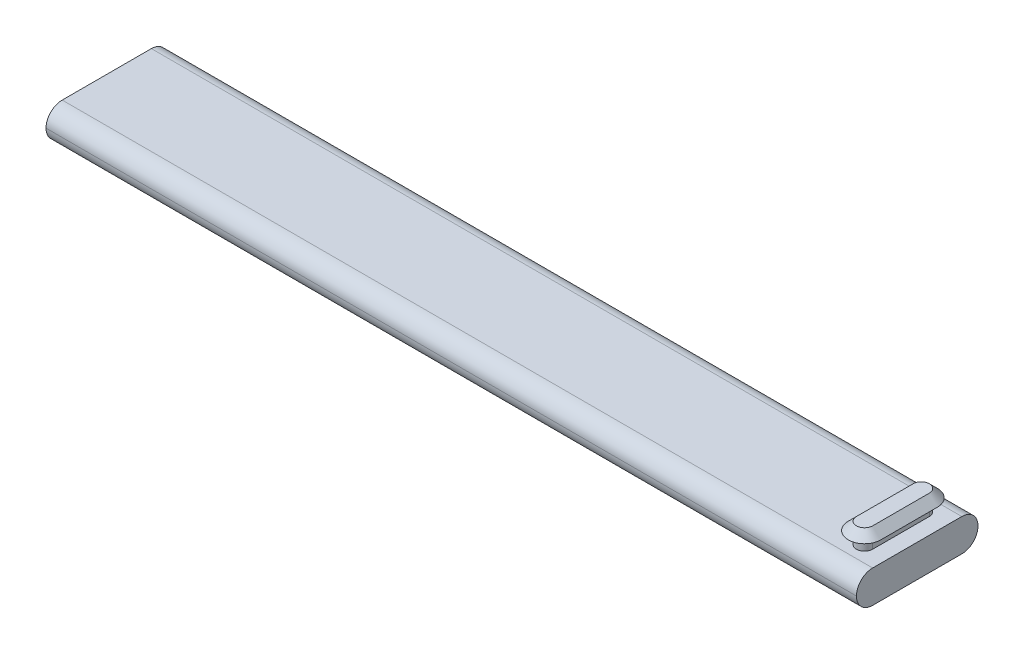
ISO-10303-21;
HEADER;
FILE_DESCRIPTION(('STEP AP214'),'2;1');
FILE_NAME('part.step','',(''),(''),'','','');
FILE_SCHEMA(('AUTOMOTIVE_DESIGN { 1 0 10303 214 1 1 1 1 }'));
ENDSEC;
DATA;
#1=APPLICATION_CONTEXT('core data for automotive mechanical design processes');
#2=APPLICATION_PROTOCOL_DEFINITION('international standard','automotive_design',2000,#1);
#3=PRODUCT_CONTEXT('',#1,'mechanical');
#4=PRODUCT('Part','Part','',(#3));
#5=PRODUCT_RELATED_PRODUCT_CATEGORY('part','',(#4));
#6=PRODUCT_DEFINITION_FORMATION('','',#4);
#7=PRODUCT_DEFINITION_CONTEXT('part definition',#1,'design');
#8=PRODUCT_DEFINITION('design','',#6,#7);
#9=PRODUCT_DEFINITION_SHAPE('','',#8);
#10=(LENGTH_UNIT() NAMED_UNIT(*) SI_UNIT(.MILLI.,.METRE.));
#11=(NAMED_UNIT(*) PLANE_ANGLE_UNIT() SI_UNIT($,.RADIAN.));
#12=(NAMED_UNIT(*) SI_UNIT($,.STERADIAN.) SOLID_ANGLE_UNIT());
#13=UNCERTAINTY_MEASURE_WITH_UNIT(LENGTH_MEASURE(1.E-05),#10,'distance_accuracy_value','');
#14=(GEOMETRIC_REPRESENTATION_CONTEXT(3) GLOBAL_UNCERTAINTY_ASSIGNED_CONTEXT((#13)) GLOBAL_UNIT_ASSIGNED_CONTEXT((#10,
#11,#12)) REPRESENTATION_CONTEXT('',''));
#15=CARTESIAN_POINT('',(0.,0.,0.));
#16=DIRECTION('',(0.,0.,1.));
#17=DIRECTION('',(1.,0.,0.));
#18=AXIS2_PLACEMENT_3D('',#15,#16,#17);
#19=CARTESIAN_POINT('',(0.,4.,0.));
#20=DIRECTION('',(0.,1.,0.));
#21=DIRECTION('',(0.,0.,1.));
#22=AXIS2_PLACEMENT_3D('',#19,#20,#21);
#23=PLANE('',#22);
#24=DIRECTION('',(0.,0.,1.));
#25=VECTOR('',#24,1.);
#26=CARTESIAN_POINT('',(-42.1538461538461,4.,-1.15384615384616));
#27=LINE('',#26,#25);
#28=CARTESIAN_POINT('',(-42.1538461538461,4.,0.846153846153838));
#29=VERTEX_POINT('',#28);
#30=CARTESIAN_POINT('',(-42.1538461538461,4.,11.8461538461538));
#31=VERTEX_POINT('',#30);
#32=EDGE_CURVE('E396',#29,#31,#27,.T.);
#33=ORIENTED_EDGE('',*,*,#32,.T.);
#34=DIRECTION('',(1.,0.,0.));
#35=VECTOR('',#34,1.);
#36=CARTESIAN_POINT('',(57.8461538461539,4.,11.8461538461538));
#37=LINE('',#36,#35);
#38=CARTESIAN_POINT('',(57.8461538461539,4.,11.8461538461538));
#39=VERTEX_POINT('',#38);
#40=EDGE_CURVE('E416',#31,#39,#37,.T.);
#41=ORIENTED_EDGE('',*,*,#40,.T.);
#42=DIRECTION('',(0.,0.,-1.));
#43=VECTOR('',#42,1.);
#44=CARTESIAN_POINT('',(57.8461538461539,4.,-1.15384615384616));
#45=LINE('',#44,#43);
#46=CARTESIAN_POINT('',(57.8461538461539,4.,0.846153846153838));
#47=VERTEX_POINT('',#46);
#48=EDGE_CURVE('E400',#39,#47,#45,.T.);
#49=ORIENTED_EDGE('',*,*,#48,.T.);
#50=DIRECTION('',(-1.,0.,0.));
#51=VECTOR('',#50,1.);
#52=CARTESIAN_POINT('',(-42.1538461538461,4.,0.846153846153838));
#53=LINE('',#52,#51);
#54=EDGE_CURVE('E405',#47,#29,#53,.T.);
#55=ORIENTED_EDGE('',*,*,#54,.T.);
#56=EDGE_LOOP('',(#33,#41,#49,#55));
#57=FACE_BOUND('',#56,.T.);
#58=DIRECTION('',(0.,0.,-1.));
#59=VECTOR('',#58,1.);
#60=CARTESIAN_POINT('',(55.8461538461539,4.,9.84615384615384));
#61=LINE('',#60,#59);
#62=CARTESIAN_POINT('',(55.8461538461539,4.,9.84615384615384));
#63=VERTEX_POINT('',#62);
#64=CARTESIAN_POINT('',(55.8461538461539,4.,2.84615384615384));
#65=VERTEX_POINT('',#64);
#66=EDGE_CURVE('E375',#63,#65,#61,.T.);
#67=ORIENTED_EDGE('',*,*,#66,.F.);
#68=CARTESIAN_POINT('',(54.8461538461539,4.,9.84615384615384));
#69=DIRECTION('',(0.,1.,0.));
#70=DIRECTION('',(0.,0.,1.));
#71=AXIS2_PLACEMENT_3D('',#68,#69,#70);
#72=CIRCLE('',#71,1.);
#73=CARTESIAN_POINT('',(53.8461538461539,4.,9.84615384615384));
#74=VERTEX_POINT('',#73);
#75=EDGE_CURVE('E371',#74,#63,#72,.T.);
#76=ORIENTED_EDGE('',*,*,#75,.F.);
#77=DIRECTION('',(0.,0.,1.));
#78=VECTOR('',#77,1.);
#79=CARTESIAN_POINT('',(53.8461538461539,4.,9.84615384615384));
#80=LINE('',#79,#78);
#81=CARTESIAN_POINT('',(53.8461538461539,4.,2.84615384615384));
#82=VERTEX_POINT('',#81);
#83=EDGE_CURVE('E358',#82,#74,#80,.T.);
#84=ORIENTED_EDGE('',*,*,#83,.F.);
#85=CARTESIAN_POINT('',(54.8461538461539,4.,2.84615384615384));
#86=DIRECTION('',(0.,1.,0.));
#87=DIRECTION('',(0.,0.,1.));
#88=AXIS2_PLACEMENT_3D('',#85,#86,#87);
#89=CIRCLE('',#88,1.);
#90=EDGE_CURVE('E378',#65,#82,#89,.T.);
#91=ORIENTED_EDGE('',*,*,#90,.F.);
#92=EDGE_LOOP('',(#67,#76,#84,#91));
#93=FACE_BOUND('',#92,.T.);
#94=ADVANCED_FACE('F143',(#57,#93),#23,.T.);
#95=CARTESIAN_POINT('',(-42.1538461538461,4.,-1.15384615384616));
#96=DIRECTION('',(1.,0.,0.));
#97=DIRECTION('',(0.,0.,-1.));
#98=AXIS2_PLACEMENT_3D('',#95,#96,#97);
#99=PLANE('',#98);
#100=CARTESIAN_POINT('',(-42.1538461538461,2.,11.8461538461538));
#101=DIRECTION('',(1.,0.,0.));
#102=DIRECTION('',(0.,0.,-1.));
#103=AXIS2_PLACEMENT_3D('',#100,#101,#102);
#104=CIRCLE('',#103,2.);
#105=CARTESIAN_POINT('',(-42.1538461538461,0.,11.8461538461538));
#106=VERTEX_POINT('',#105);
#107=CARTESIAN_POINT('',(-42.1538461538461,2.,13.8461538461538));
#108=VERTEX_POINT('',#107);
#109=EDGE_CURVE('E438',#106,#108,#104,.F.);
#110=ORIENTED_EDGE('',*,*,#109,.T.);
#111=CARTESIAN_POINT('',(-42.1538461538461,2.,11.8461538461538));
#112=DIRECTION('',(1.,0.,0.));
#113=DIRECTION('',(0.,0.,-1.));
#114=AXIS2_PLACEMENT_3D('',#111,#112,#113);
#115=CIRCLE('',#114,2.);
#116=EDGE_CURVE('E441',#108,#31,#115,.F.);
#117=ORIENTED_EDGE('',*,*,#116,.T.);
#118=ORIENTED_EDGE('',*,*,#32,.F.);
#119=CARTESIAN_POINT('',(-42.1538461538461,2.,0.846153846153838));
#120=DIRECTION('',(1.,0.,0.));
#121=DIRECTION('',(0.,0.,-1.));
#122=AXIS2_PLACEMENT_3D('',#119,#120,#121);
#123=CIRCLE('',#122,2.);
#124=CARTESIAN_POINT('',(-42.1538461538461,2.,-1.15384615384616));
#125=VERTEX_POINT('',#124);
#126=EDGE_CURVE('E432',#29,#125,#123,.F.);
#127=ORIENTED_EDGE('',*,*,#126,.T.);
#128=CARTESIAN_POINT('',(-42.1538461538461,2.,0.846153846153838));
#129=DIRECTION('',(1.,0.,0.));
#130=DIRECTION('',(0.,0.,-1.));
#131=AXIS2_PLACEMENT_3D('',#128,#129,#130);
#132=CIRCLE('',#131,2.);
#133=CARTESIAN_POINT('',(-42.1538461538461,0.,0.846153846153838));
#134=VERTEX_POINT('',#133);
#135=EDGE_CURVE('E435',#125,#134,#132,.F.);
#136=ORIENTED_EDGE('',*,*,#135,.T.);
#137=DIRECTION('',(0.,0.,1.));
#138=VECTOR('',#137,1.);
#139=CARTESIAN_POINT('',(-42.1538461538461,0.,-1.15384615384616));
#140=LINE('',#139,#138);
#141=EDGE_CURVE('E406',#134,#106,#140,.T.);
#142=ORIENTED_EDGE('',*,*,#141,.T.);
#143=EDGE_LOOP('',(#110,#117,#118,#127,#136,#142));
#144=FACE_BOUND('',#143,.T.);
#145=ADVANCED_FACE('F483',(#144),#99,.F.);
#146=CARTESIAN_POINT('',(57.8461538461539,4.,-1.15384615384616));
#147=DIRECTION('',(-1.,0.,0.));
#148=DIRECTION('',(0.,0.,1.));
#149=AXIS2_PLACEMENT_3D('',#146,#147,#148);
#150=PLANE('',#149);
#151=ORIENTED_EDGE('',*,*,#48,.F.);
#152=CARTESIAN_POINT('',(57.8461538461539,2.,11.8461538461538));
#153=DIRECTION('',(-1.,0.,0.));
#154=DIRECTION('',(0.,0.,1.));
#155=AXIS2_PLACEMENT_3D('',#152,#153,#154);
#156=CIRCLE('',#155,2.);
#157=CARTESIAN_POINT('',(57.8461538461539,2.,13.8461538461538));
#158=VERTEX_POINT('',#157);
#159=EDGE_CURVE('E429',#39,#158,#156,.F.);
#160=ORIENTED_EDGE('',*,*,#159,.T.);
#161=CARTESIAN_POINT('',(57.8461538461539,2.,11.8461538461538));
#162=DIRECTION('',(-1.,0.,0.));
#163=DIRECTION('',(0.,0.,1.));
#164=AXIS2_PLACEMENT_3D('',#161,#162,#163);
#165=CIRCLE('',#164,2.);
#166=CARTESIAN_POINT('',(57.8461538461539,0.,11.8461538461538));
#167=VERTEX_POINT('',#166);
#168=EDGE_CURVE('E426',#158,#167,#165,.F.);
#169=ORIENTED_EDGE('',*,*,#168,.T.);
#170=DIRECTION('',(0.,0.,-1.));
#171=VECTOR('',#170,1.);
#172=CARTESIAN_POINT('',(57.8461538461539,0.,-1.15384615384616));
#173=LINE('',#172,#171);
#174=CARTESIAN_POINT('',(57.8461538461539,0.,0.846153846153838));
#175=VERTEX_POINT('',#174);
#176=EDGE_CURVE('E401',#167,#175,#173,.T.);
#177=ORIENTED_EDGE('',*,*,#176,.T.);
#178=CARTESIAN_POINT('',(57.8461538461539,2.,0.846153846153838));
#179=DIRECTION('',(-1.,0.,0.));
#180=DIRECTION('',(0.,0.,1.));
#181=AXIS2_PLACEMENT_3D('',#178,#179,#180);
#182=CIRCLE('',#181,2.);
#183=CARTESIAN_POINT('',(57.8461538461539,2.,-1.15384615384616));
#184=VERTEX_POINT('',#183);
#185=EDGE_CURVE('E423',#175,#184,#182,.F.);
#186=ORIENTED_EDGE('',*,*,#185,.T.);
#187=CARTESIAN_POINT('',(57.8461538461539,2.,0.846153846153838));
#188=DIRECTION('',(-1.,0.,0.));
#189=DIRECTION('',(0.,0.,1.));
#190=AXIS2_PLACEMENT_3D('',#187,#188,#189);
#191=CIRCLE('',#190,2.);
#192=EDGE_CURVE('E420',#184,#47,#191,.F.);
#193=ORIENTED_EDGE('',*,*,#192,.T.);
#194=EDGE_LOOP('',(#151,#160,#169,#177,#186,#193));
#195=FACE_BOUND('',#194,.T.);
#196=ADVANCED_FACE('F464',(#195),#150,.F.);
#197=CARTESIAN_POINT('',(0.,0.,0.));
#198=DIRECTION('',(0.,1.,0.));
#199=DIRECTION('',(0.,0.,1.));
#200=AXIS2_PLACEMENT_3D('',#197,#198,#199);
#201=PLANE('',#200);
#202=ORIENTED_EDGE('',*,*,#176,.F.);
#203=DIRECTION('',(1.,0.,0.));
#204=VECTOR('',#203,1.);
#205=CARTESIAN_POINT('',(0.,0.,11.8461538461538));
#206=LINE('',#205,#204);
#207=EDGE_CURVE('E12',#167,#106,#206,.F.);
#208=ORIENTED_EDGE('',*,*,#207,.T.);
#209=ORIENTED_EDGE('',*,*,#141,.F.);
#210=DIRECTION('',(-1.,0.,0.));
#211=VECTOR('',#210,1.);
#212=CARTESIAN_POINT('',(0.,0.,0.846153846153838));
#213=LINE('',#212,#211);
#214=EDGE_CURVE('E154',#134,#175,#213,.F.);
#215=ORIENTED_EDGE('',*,*,#214,.T.);
#216=EDGE_LOOP('',(#202,#208,#209,#215));
#217=FACE_BOUND('',#216,.T.);
#218=ADVANCED_FACE('F481',(#217),#201,.F.);
#219=CARTESIAN_POINT('',(-42.1538461538461,2.,11.8461538461538));
#220=DIRECTION('',(1.,0.,0.));
#221=DIRECTION('',(0.,0.,-1.));
#222=AXIS2_PLACEMENT_3D('',#219,#220,#221);
#223=CYLINDRICAL_SURFACE('',#222,2.);
#224=DIRECTION('',(1.,0.,0.));
#225=VECTOR('',#224,1.);
#226=CARTESIAN_POINT('',(-42.1538461538461,2.,13.8461538461538));
#227=LINE('',#226,#225);
#228=EDGE_CURVE('E410',#108,#158,#227,.T.);
#229=ORIENTED_EDGE('',*,*,#228,.F.);
#230=ORIENTED_EDGE('',*,*,#109,.F.);
#231=ORIENTED_EDGE('',*,*,#207,.F.);
#232=ORIENTED_EDGE('',*,*,#168,.F.);
#233=EDGE_LOOP('',(#229,#230,#231,#232));
#234=FACE_BOUND('',#233,.T.);
#235=ADVANCED_FACE('F477',(#234),#223,.T.);
#236=CARTESIAN_POINT('',(0.,2.,11.8461538461538));
#237=DIRECTION('',(-1.,0.,0.));
#238=DIRECTION('',(0.,0.,1.));
#239=AXIS2_PLACEMENT_3D('',#236,#237,#238);
#240=CYLINDRICAL_SURFACE('',#239,2.);
#241=ORIENTED_EDGE('',*,*,#116,.F.);
#242=ORIENTED_EDGE('',*,*,#228,.T.);
#243=ORIENTED_EDGE('',*,*,#159,.F.);
#244=ORIENTED_EDGE('',*,*,#40,.F.);
#245=EDGE_LOOP('',(#241,#242,#243,#244));
#246=FACE_BOUND('',#245,.T.);
#247=ADVANCED_FACE('F471',(#246),#240,.T.);
#248=CARTESIAN_POINT('',(0.,2.,0.846153846153838));
#249=DIRECTION('',(1.,0.,0.));
#250=DIRECTION('',(0.,0.,-1.));
#251=AXIS2_PLACEMENT_3D('',#248,#249,#250);
#252=CYLINDRICAL_SURFACE('',#251,2.);
#253=ORIENTED_EDGE('',*,*,#54,.F.);
#254=ORIENTED_EDGE('',*,*,#192,.F.);
#255=DIRECTION('',(-1.,0.,0.));
#256=VECTOR('',#255,1.);
#257=CARTESIAN_POINT('',(57.8461538461539,2.,-1.15384615384616));
#258=LINE('',#257,#256);
#259=EDGE_CURVE('E395',#125,#184,#258,.F.);
#260=ORIENTED_EDGE('',*,*,#259,.F.);
#261=ORIENTED_EDGE('',*,*,#126,.F.);
#262=EDGE_LOOP('',(#253,#254,#260,#261));
#263=FACE_BOUND('',#262,.T.);
#264=ADVANCED_FACE('F145',(#263),#252,.T.);
#265=CARTESIAN_POINT('',(-42.1538461538461,2.,0.846153846153838));
#266=DIRECTION('',(-1.,0.,0.));
#267=DIRECTION('',(0.,0.,1.));
#268=AXIS2_PLACEMENT_3D('',#265,#266,#267);
#269=CYLINDRICAL_SURFACE('',#268,2.);
#270=ORIENTED_EDGE('',*,*,#185,.F.);
#271=ORIENTED_EDGE('',*,*,#214,.F.);
#272=ORIENTED_EDGE('',*,*,#135,.F.);
#273=ORIENTED_EDGE('',*,*,#259,.T.);
#274=EDGE_LOOP('',(#270,#271,#272,#273));
#275=FACE_BOUND('',#274,.T.);
#276=ADVANCED_FACE('F456',(#275),#269,.T.);
#277=CARTESIAN_POINT('',(54.8461538461539,5.5,9.84615384615384));
#278=DIRECTION('',(0.,-1.,0.));
#279=DIRECTION('',(0.,0.,-1.));
#280=AXIS2_PLACEMENT_3D('',#277,#278,#279);
#281=CYLINDRICAL_SURFACE('',#280,1.);
#282=ORIENTED_EDGE('',*,*,#75,.T.);
#283=DIRECTION('',(0.,-1.,0.));
#284=VECTOR('',#283,1.);
#285=CARTESIAN_POINT('',(55.8461538461539,5.5,9.84615384615384));
#286=LINE('',#285,#284);
#287=CARTESIAN_POINT('',(55.8461538461539,5.5,9.84615384615384));
#288=VERTEX_POINT('',#287);
#289=EDGE_CURVE('E392',#288,#63,#286,.T.);
#290=ORIENTED_EDGE('',*,*,#289,.F.);
#291=CARTESIAN_POINT('',(54.8461538461539,5.5,9.84615384615384));
#292=DIRECTION('',(0.,1.,0.));
#293=DIRECTION('',(0.,0.,1.));
#294=AXIS2_PLACEMENT_3D('',#291,#292,#293);
#295=CIRCLE('',#294,1.);
#296=CARTESIAN_POINT('',(53.8461538461539,5.5,9.84615384615384));
#297=VERTEX_POINT('',#296);
#298=EDGE_CURVE('E348',#297,#288,#295,.T.);
#299=ORIENTED_EDGE('',*,*,#298,.F.);
#300=DIRECTION('',(0.,-1.,0.));
#301=VECTOR('',#300,1.);
#302=CARTESIAN_POINT('',(53.8461538461539,5.5,9.84615384615384));
#303=LINE('',#302,#301);
#304=EDGE_CURVE('E370',#297,#74,#303,.T.);
#305=ORIENTED_EDGE('',*,*,#304,.T.);
#306=EDGE_LOOP('',(#282,#290,#299,#305));
#307=FACE_BOUND('',#306,.T.);
#308=ADVANCED_FACE('F498',(#307),#281,.T.);
#309=CARTESIAN_POINT('',(55.8461538461539,5.5,9.84615384615384));
#310=DIRECTION('',(-1.,0.,0.));
#311=DIRECTION('',(0.,0.,1.));
#312=AXIS2_PLACEMENT_3D('',#309,#310,#311);
#313=PLANE('',#312);
#314=ORIENTED_EDGE('',*,*,#66,.T.);
#315=DIRECTION('',(0.,-1.,0.));
#316=VECTOR('',#315,1.);
#317=CARTESIAN_POINT('',(55.8461538461539,5.5,2.84615384615384));
#318=LINE('',#317,#316);
#319=CARTESIAN_POINT('',(55.8461538461539,5.5,2.84615384615384));
#320=VERTEX_POINT('',#319);
#321=EDGE_CURVE('E388',#320,#65,#318,.T.);
#322=ORIENTED_EDGE('',*,*,#321,.F.);
#323=DIRECTION('',(0.,0.,-1.));
#324=VECTOR('',#323,1.);
#325=CARTESIAN_POINT('',(55.8461538461539,5.5,9.84615384615384));
#326=LINE('',#325,#324);
#327=EDGE_CURVE('E357',#288,#320,#326,.T.);
#328=ORIENTED_EDGE('',*,*,#327,.F.);
#329=ORIENTED_EDGE('',*,*,#289,.T.);
#330=EDGE_LOOP('',(#314,#322,#328,#329));
#331=FACE_BOUND('',#330,.T.);
#332=ADVANCED_FACE('F503',(#331),#313,.F.);
#333=CARTESIAN_POINT('',(54.8461538461539,5.5,2.84615384615384));
#334=DIRECTION('',(0.,-1.,0.));
#335=DIRECTION('',(0.,0.,-1.));
#336=AXIS2_PLACEMENT_3D('',#333,#334,#335);
#337=CYLINDRICAL_SURFACE('',#336,1.);
#338=ORIENTED_EDGE('',*,*,#90,.T.);
#339=DIRECTION('',(0.,-1.,0.));
#340=VECTOR('',#339,1.);
#341=CARTESIAN_POINT('',(53.8461538461539,5.5,2.84615384615384));
#342=LINE('',#341,#340);
#343=CARTESIAN_POINT('',(53.8461538461539,5.5,2.84615384615384));
#344=VERTEX_POINT('',#343);
#345=EDGE_CURVE('E162',#344,#82,#342,.T.);
#346=ORIENTED_EDGE('',*,*,#345,.F.);
#347=CARTESIAN_POINT('',(54.8461538461539,5.5,2.84615384615384));
#348=DIRECTION('',(0.,1.,0.));
#349=DIRECTION('',(0.,0.,1.));
#350=AXIS2_PLACEMENT_3D('',#347,#348,#349);
#351=CIRCLE('',#350,1.);
#352=EDGE_CURVE('E362',#320,#344,#351,.T.);
#353=ORIENTED_EDGE('',*,*,#352,.F.);
#354=ORIENTED_EDGE('',*,*,#321,.T.);
#355=EDGE_LOOP('',(#338,#346,#353,#354));
#356=FACE_BOUND('',#355,.T.);
#357=ADVANCED_FACE('F561',(#356),#337,.T.);
#358=CARTESIAN_POINT('',(53.8461538461539,5.5,9.84615384615384));
#359=DIRECTION('',(1.,0.,0.));
#360=DIRECTION('',(0.,0.,-1.));
#361=AXIS2_PLACEMENT_3D('',#358,#359,#360);
#362=PLANE('',#361);
#363=ORIENTED_EDGE('',*,*,#83,.T.);
#364=ORIENTED_EDGE('',*,*,#304,.F.);
#365=DIRECTION('',(0.,0.,1.));
#366=VECTOR('',#365,1.);
#367=CARTESIAN_POINT('',(53.8461538461539,5.5,9.84615384615384));
#368=LINE('',#367,#366);
#369=EDGE_CURVE('E366',#344,#297,#368,.T.);
#370=ORIENTED_EDGE('',*,*,#369,.F.);
#371=ORIENTED_EDGE('',*,*,#345,.T.);
#372=EDGE_LOOP('',(#363,#364,#370,#371));
#373=FACE_BOUND('',#372,.T.);
#374=ADVANCED_FACE('F570',(#373),#362,.F.);
#375=CARTESIAN_POINT('',(54.8461538461539,5.5,2.84615384615384));
#376=DIRECTION('',(0.,1.,0.));
#377=DIRECTION('',(0.,0.,1.));
#378=AXIS2_PLACEMENT_3D('',#375,#376,#377);
#379=PLANE('',#378);
#380=CARTESIAN_POINT('',(56.8461538461539,5.5,2.84615384615384));
#381=CARTESIAN_POINT('',(56.8461543730414,5.5,2.78433684679386));
#382=CARTESIAN_POINT('',(56.843279242986,5.5,2.72252124539878));
#383=CARTESIAN_POINT('',(56.8318346391368,5.5,2.59941611233734));
#384=CARTESIAN_POINT('',(56.8232648736393,5.5,2.53812660778283));
#385=CARTESIAN_POINT('',(56.8005071494665,5.5,2.41670565605386));
#386=CARTESIAN_POINT('',(56.7863286714719,5.5,2.35657243330417));
#387=CARTESIAN_POINT('',(56.7524435750771,5.5,2.23789277183486));
#388=CARTESIAN_POINT('',(56.732737769672,5.50000000000001,2.17934610114257));
#389=CARTESIAN_POINT('',(56.6900052461637,5.50000000000001,2.06949942265759));
#390=CARTESIAN_POINT('',(56.6674361400265,5.5,2.01802101883091));
#391=CARTESIAN_POINT('',(56.6180952173609,5.5,1.91713509241038));
#392=CARTESIAN_POINT('',(56.5913233726847,5.5,1.86772758368912));
#393=CARTESIAN_POINT('',(56.5049578708521,5.5,1.72317745729217));
#394=CARTESIAN_POINT('',(56.4392637121512,5.5,1.63157768047816));
#395=CARTESIAN_POINT('',(56.2930853950114,5.5,1.46074684595036));
#396=CARTESIAN_POINT('',(56.2125717181953,5.5,1.38154106844215));
#397=CARTESIAN_POINT('',(56.0829249027176,5.5,1.27357065620939));
#398=CARTESIAN_POINT('',(56.038202907921,5.5,1.23937109355906));
#399=CARTESIAN_POINT('',(55.9460505253853,5.5,1.17481929313315));
#400=CARTESIAN_POINT('',(55.8986204155102,5.50000000000001,1.14446666167159));
#401=CARTESIAN_POINT('',(55.8011647708706,5.50000000000001,1.08777798690794));
#402=CARTESIAN_POINT('',(55.7511296716664,5.5,1.06145838347466));
#403=CARTESIAN_POINT('',(55.6489567478741,5.5,1.01327938927253));
#404=CARTESIAN_POINT('',(55.5968188941753,5.5,0.991420060277185));
#405=CARTESIAN_POINT('',(55.4908900173283,5.5,0.952184967984817));
#406=CARTESIAN_POINT('',(55.4370992405843,5.5,0.934808540007172));
#407=CARTESIAN_POINT('',(55.3282792161878,5.5,0.904582239088427));
#408=CARTESIAN_POINT('',(55.2732498328647,5.5,0.891732864609685));
#409=CARTESIAN_POINT('',(55.1073622813411,5.5,0.860206051062649));
#410=CARTESIAN_POINT('',(54.995078764114,5.5,0.848319567295452));
#411=CARTESIAN_POINT('',(54.8265482724975,5.5,0.845158487752516));
#412=CARTESIAN_POINT('',(54.7703312060214,5.5,0.846553095074365));
#413=CARTESIAN_POINT('',(54.6581973161205,5.5,0.854132505811701));
#414=CARTESIAN_POINT('',(54.6022805391527,5.49999999999999,0.860318030075225));
#415=CARTESIAN_POINT('',(54.4915524705078,5.49999999999999,0.877250254452221));
#416=CARTESIAN_POINT('',(54.4367361657769,5.5,0.887964511553524));
#417=CARTESIAN_POINT('',(54.3281676941698,5.5,0.913847298382436));
#418=CARTESIAN_POINT('',(54.2744154905111,5.5,0.929015673857914));
#419=CARTESIAN_POINT('',(54.1683323782167,5.5,0.963737042248338));
#420=CARTESIAN_POINT('',(54.116001597259,5.5,0.983290427592005));
#421=CARTESIAN_POINT('',(54.0132165572031,5.5,1.02677621843398));
#422=CARTESIAN_POINT('',(53.9627621287056,5.5,1.05070822746448));
#423=CARTESIAN_POINT('',(53.8137125936494,5.49999999999999,1.12937576371821));
#424=CARTESIAN_POINT('',(53.7184426562027,5.5,1.19065309678968));
#425=CARTESIAN_POINT('',(53.5842890093252,5.5,1.29363343219239));
#426=CARTESIAN_POINT('',(53.5410110754544,5.5,1.32982421902473));
#427=CARTESIAN_POINT('',(53.4576103749366,5.5,1.4056997795841));
#428=CARTESIAN_POINT('',(53.4174871941764,5.5,1.44538409327396));
#429=CARTESIAN_POINT('',(53.3407095113022,5.5,1.52810727830821));
#430=CARTESIAN_POINT('',(53.3040614538337,5.5,1.57115212238405));
#431=CARTESIAN_POINT('',(53.2345839407954,5.5,1.66022570429469));
#432=CARTESIAN_POINT('',(53.2017547746238,5.5,1.70625466785704));
#433=CARTESIAN_POINT('',(53.1400930194612,5.5,1.80093659164));
#434=CARTESIAN_POINT('',(53.1112618044768,5.5,1.84959044603649));
#435=CARTESIAN_POINT('',(53.0577881054033,5.5,1.94914319303456));
#436=CARTESIAN_POINT('',(53.0331454385388,5.5,2.00004198755167));
#437=CARTESIAN_POINT('',(52.9883551371462,5.5,2.10345189476299));
#438=CARTESIAN_POINT('',(52.9681832473657,5.5,2.1559524567717));
#439=CARTESIAN_POINT('',(52.932360483158,5.5,2.26245629884727));
#440=CARTESIAN_POINT('',(52.9167101166936,5.5,2.3164597470068));
#441=CARTESIAN_POINT('',(52.8767508329078,5.5,2.47998542788326));
#442=CARTESIAN_POINT('',(52.8593039040618,5.5,2.59132336918967));
#443=CARTESIAN_POINT('',(52.8495719143483,5.5,2.72692861704385));
#444=CARTESIAN_POINT('',(52.8482902740442,5.5,2.75077184277421));
#445=CARTESIAN_POINT('',(52.8465826542884,5.5,2.79845788116547));
#446=CARTESIAN_POINT('',(52.846155564093,5.5,2.82230065402852));
#447=CARTESIAN_POINT('',(52.8461538461539,5.5,2.84615384615383));
#448=B_SPLINE_CURVE_WITH_KNOTS('',3,(#380,#381,#382,#383,#384,#385,#386,#387,#388,#389,#390,
#391,#392,#393,#394,#395,#396,#397,#398,#399,#400,#401,#402,#403,#404,#405,#406,#407,#408,#409,
#410,#411,#412,#413,#414,#415,#416,#417,#418,#419,#420,#421,#422,#423,#424,#425,#426,#427,#428,
#429,#430,#431,#432,#433,#434,#435,#436,#437,#438,#439,#440,#441,#442,#443,#444,#445,#446,#447),
.UNSPECIFIED.,.F.,.F.,(4,2,2,2,2,2,2,2,2,2,2,2,2,2,2,2,2,2,2,2,2,2,2,2,2,2,2,2,2,2,2,2,2,4),(0.,
0.18538302653142,0.37077554990777,0.555856025231364,0.74090929197607,0.909331678701512,
1.07775519348167,1.41419019202739,1.75130271938412,1.9200444457549,2.08876888952273,
2.25816378868061,2.42756103374955,2.59693314780187,2.76632390516333,3.10312678058668,
3.27166425381443,3.44022709035245,3.60760231002634,3.77497173395398,3.94235614229452,
4.10972540210453,4.4476151918822,4.61672186068732,4.78580629427879,4.95519840290715,
5.12460333983556,5.29406635392314,5.46352197126207,5.63203442509576,5.80056580282383,
6.13665836222437,6.20828648308364,6.27982144111266),.UNSPECIFIED.);
#449=CARTESIAN_POINT('',(56.8461538461539,5.5,2.84615384615384));
#450=VERTEX_POINT('',#449);
#451=CARTESIAN_POINT('',(52.8461538461539,5.5,2.84615384615384));
#452=VERTEX_POINT('',#451);
#453=EDGE_CURVE('E249',#450,#452,#448,.T.);
#454=ORIENTED_EDGE('',*,*,#453,.F.);
#455=DIRECTION('',(0.,0.,-1.));
#456=VECTOR('',#455,1.);
#457=CARTESIAN_POINT('',(56.8461538461539,5.5,2.84615384615384));
#458=LINE('',#457,#456);
#459=CARTESIAN_POINT('',(56.8461538461539,5.5,9.84615384615384));
#460=VERTEX_POINT('',#459);
#461=EDGE_CURVE('E242',#460,#450,#458,.T.);
#462=ORIENTED_EDGE('',*,*,#461,.F.);
#463=CARTESIAN_POINT('',(52.8461538461539,5.5,9.84615384615384));
#464=CARTESIAN_POINT('',(52.8461533192664,5.5,9.90797084551381));
#465=CARTESIAN_POINT('',(52.8490284493217,5.5,9.96978644690889));
#466=CARTESIAN_POINT('',(52.8604730531709,5.5,10.0928915799703));
#467=CARTESIAN_POINT('',(52.8690428186684,5.5,10.1541810845249));
#468=CARTESIAN_POINT('',(52.8918005428413,5.5,10.2756020362538));
#469=CARTESIAN_POINT('',(52.9059790208358,5.5,10.3357352590035));
#470=CARTESIAN_POINT('',(52.9398641172307,5.5,10.4544149204728));
#471=CARTESIAN_POINT('',(52.9595699226357,5.50000000000001,10.5129615911651));
#472=CARTESIAN_POINT('',(53.002302446144,5.50000000000001,10.6228082696501));
#473=CARTESIAN_POINT('',(53.0248715522813,5.5,10.6742866734768));
#474=CARTESIAN_POINT('',(53.0742124749469,5.5,10.7751725998973));
#475=CARTESIAN_POINT('',(53.100984319623,5.5,10.8245801086186));
#476=CARTESIAN_POINT('',(53.1873498214557,5.5,10.9691302350156));
#477=CARTESIAN_POINT('',(53.2530439801566,5.49999999999999,11.0607300118296));
#478=CARTESIAN_POINT('',(53.3992222972964,5.49999999999999,11.2315608463574));
#479=CARTESIAN_POINT('',(53.4797359741125,5.5,11.3107666238656));
#480=CARTESIAN_POINT('',(53.6093827895902,5.5,11.4187370360984));
#481=CARTESIAN_POINT('',(53.6541047843868,5.5,11.4529365987487));
#482=CARTESIAN_POINT('',(53.7462571669225,5.5,11.5174883991746));
#483=CARTESIAN_POINT('',(53.7936872767976,5.50000000000001,11.5478410306361));
#484=CARTESIAN_POINT('',(53.8911429214372,5.50000000000001,11.6045297053998));
#485=CARTESIAN_POINT('',(53.9411780206414,5.5,11.6308493088331));
#486=CARTESIAN_POINT('',(54.0433509444337,5.5,11.6790283030352));
#487=CARTESIAN_POINT('',(54.0954887981325,5.5,11.7008876320305));
#488=CARTESIAN_POINT('',(54.2014176749795,5.5,11.7401227243229));
#489=CARTESIAN_POINT('',(54.2552084517235,5.5,11.7574991523005));
#490=CARTESIAN_POINT('',(54.36402847612,5.5,11.7877254532193));
#491=CARTESIAN_POINT('',(54.4190578594431,5.5,11.800574827698));
#492=CARTESIAN_POINT('',(54.5849454109667,5.5,11.832101641245));
#493=CARTESIAN_POINT('',(54.6972289281938,5.5,11.8439881250122));
#494=CARTESIAN_POINT('',(54.8657594198102,5.5,11.8471492045552));
#495=CARTESIAN_POINT('',(54.9219764862864,5.5,11.8457545972333));
#496=CARTESIAN_POINT('',(55.0341103761873,5.5,11.838175186496));
#497=CARTESIAN_POINT('',(55.090027153155,5.49999999999999,11.8319896622324));
#498=CARTESIAN_POINT('',(55.2007552218,5.49999999999999,11.8150574378554));
#499=CARTESIAN_POINT('',(55.2555715265308,5.5,11.8043431807541));
#500=CARTESIAN_POINT('',(55.3641399981379,5.5,11.7784603939252));
#501=CARTESIAN_POINT('',(55.4178922017966,5.5,11.7632920184497));
#502=CARTESIAN_POINT('',(55.523975314091,5.5,11.7285706500593));
#503=CARTESIAN_POINT('',(55.5763060950488,5.5,11.7090172647157));
#504=CARTESIAN_POINT('',(55.6790911351047,5.5,11.6655314738737));
#505=CARTESIAN_POINT('',(55.7295455636022,5.5,11.6415994648432));
#506=CARTESIAN_POINT('',(55.8785950986584,5.49999999999999,11.5629319285894));
#507=CARTESIAN_POINT('',(55.973865036105,5.5,11.501654595518));
#508=CARTESIAN_POINT('',(56.1080186829826,5.5,11.3986742601152));
#509=CARTESIAN_POINT('',(56.1512966168534,5.5,11.3624834732829));
#510=CARTESIAN_POINT('',(56.2346973173712,5.5,11.2866079127235));
#511=CARTESIAN_POINT('',(56.2748204981313,5.5,11.2469235990336));
#512=CARTESIAN_POINT('',(56.3515981810056,5.5,11.1642004139994));
#513=CARTESIAN_POINT('',(56.388246238474,5.5,11.1211555699236));
#514=CARTESIAN_POINT('',(56.4577237515123,5.5,11.0320819880129));
#515=CARTESIAN_POINT('',(56.4905529176839,5.5,10.9860530244506));
#516=CARTESIAN_POINT('',(56.5522146728465,5.5,10.8913711006677));
#517=CARTESIAN_POINT('',(56.581045887831,5.5,10.8427172462712));
#518=CARTESIAN_POINT('',(56.6345195869044,5.5,10.7431644992731));
#519=CARTESIAN_POINT('',(56.6591622537689,5.5,10.692265704756));
#520=CARTESIAN_POINT('',(56.7039525551615,5.5,10.5888557975447));
#521=CARTESIAN_POINT('',(56.724124444942,5.5,10.536355235536));
#522=CARTESIAN_POINT('',(56.7599472091497,5.5,10.4298513934604));
#523=CARTESIAN_POINT('',(56.7755975756141,5.5,10.3758479453009));
#524=CARTESIAN_POINT('',(56.8155568593999,5.5,10.2123222644244));
#525=CARTESIAN_POINT('',(56.833003788246,5.5,10.1009843231179));
#526=CARTESIAN_POINT('',(56.8427357779594,5.5,9.96537907526377));
#527=CARTESIAN_POINT('',(56.8440174182636,5.5,9.94153584953341));
#528=CARTESIAN_POINT('',(56.8457250380193,5.5,9.89384981114218));
#529=CARTESIAN_POINT('',(56.8461521282147,5.5,9.87000703827915));
#530=CARTESIAN_POINT('',(56.8461538461539,5.5,9.84615384615385));
#531=B_SPLINE_CURVE_WITH_KNOTS('',3,(#463,#464,#465,#466,#467,#468,#469,#470,#471,#472,#473,
#474,#475,#476,#477,#478,#479,#480,#481,#482,#483,#484,#485,#486,#487,#488,#489,#490,#491,#492,
#493,#494,#495,#496,#497,#498,#499,#500,#501,#502,#503,#504,#505,#506,#507,#508,#509,#510,#511,
#512,#513,#514,#515,#516,#517,#518,#519,#520,#521,#522,#523,#524,#525,#526,#527,#528,#529,#530),
.UNSPECIFIED.,.F.,.F.,(4,2,2,2,2,2,2,2,2,2,2,2,2,2,2,2,2,2,2,2,2,2,2,2,2,2,2,2,2,2,2,2,2,4),(0.,
0.185383026531416,0.370775549907763,0.55585602523136,0.740909291976064,0.909331678701549,
1.07775519348174,1.41419019202754,1.75130271938425,1.92004444575502,2.08876888952283,
2.25816378868071,2.42756103374964,2.59693314780196,2.76632390516342,3.10312678058674,
3.27166425381447,3.44022709035246,3.60760231002637,3.77497173395401,3.94235614229456,
4.10972540210458,4.44761519188226,4.61672186068738,4.78580629427886,4.95519840290719,
5.12460333983556,5.29406635392311,5.463521971262,5.63203442509573,5.80056580282383,
6.13665836222444,6.20828648308367,6.27982144111265),.UNSPECIFIED.);
#532=CARTESIAN_POINT('',(52.8461538461539,5.5,9.84615384615384));
#533=VERTEX_POINT('',#532);
#534=EDGE_CURVE('E247',#533,#460,#531,.T.);
#535=ORIENTED_EDGE('',*,*,#534,.F.);
#536=DIRECTION('',(0.,0.,1.));
#537=VECTOR('',#536,1.);
#538=CARTESIAN_POINT('',(52.8461538461539,5.5,2.84615384615384));
#539=LINE('',#538,#537);
#540=EDGE_CURVE('E255',#452,#533,#539,.T.);
#541=ORIENTED_EDGE('',*,*,#540,.F.);
#542=EDGE_LOOP('',(#454,#462,#535,#541));
#543=FACE_BOUND('',#542,.T.);
#544=ORIENTED_EDGE('',*,*,#369,.T.);
#545=ORIENTED_EDGE('',*,*,#298,.T.);
#546=ORIENTED_EDGE('',*,*,#327,.T.);
#547=ORIENTED_EDGE('',*,*,#352,.T.);
#548=EDGE_LOOP('',(#544,#545,#546,#547));
#549=FACE_BOUND('',#548,.T.);
#550=ADVANCED_FACE('F245',(#543,#549),#379,.F.);
#551=CARTESIAN_POINT('',(54.8461538461539,6.5,2.84615384615384));
#552=DIRECTION('',(0.,1.,0.));
#553=DIRECTION('',(0.,0.,1.));
#554=AXIS2_PLACEMENT_3D('',#551,#552,#553);
#555=PLANE('',#554);
#556=CARTESIAN_POINT('',(54.8461538461539,6.5,2.84615384615384));
#557=DIRECTION('',(0.,1.,0.));
#558=DIRECTION('',(0.,0.,1.));
#559=AXIS2_PLACEMENT_3D('',#556,#557,#558);
#560=CIRCLE('',#559,1.);
#561=CARTESIAN_POINT('',(55.8461538461539,6.5,2.84615384615384));
#562=VERTEX_POINT('',#561);
#563=CARTESIAN_POINT('',(53.8461538461539,6.5,2.84615384615339));
#564=VERTEX_POINT('',#563);
#565=EDGE_CURVE('E251',#562,#564,#560,.T.);
#566=ORIENTED_EDGE('',*,*,#565,.T.);
#567=DIRECTION('',(0.,0.,1.));
#568=VECTOR('',#567,1.);
#569=CARTESIAN_POINT('',(53.8461538461539,6.5,2.84615384615384));
#570=LINE('',#569,#568);
#571=CARTESIAN_POINT('',(53.8461538461539,6.5,9.84615384615383));
#572=VERTEX_POINT('',#571);
#573=EDGE_CURVE('E328',#564,#572,#570,.T.);
#574=ORIENTED_EDGE('',*,*,#573,.T.);
#575=CARTESIAN_POINT('',(54.8461538461539,6.5,9.84615384615384));
#576=DIRECTION('',(0.,1.,0.));
#577=DIRECTION('',(0.,0.,1.));
#578=AXIS2_PLACEMENT_3D('',#575,#576,#577);
#579=CIRCLE('',#578,1.);
#580=CARTESIAN_POINT('',(55.8461538461539,6.5,9.84615384615384));
#581=VERTEX_POINT('',#580);
#582=EDGE_CURVE('E322',#572,#581,#579,.T.);
#583=ORIENTED_EDGE('',*,*,#582,.T.);
#584=DIRECTION('',(0.,0.,-1.));
#585=VECTOR('',#584,1.);
#586=CARTESIAN_POINT('',(55.8461538461539,6.5,2.84615384615384));
#587=LINE('',#586,#585);
#588=EDGE_CURVE('E327',#581,#562,#587,.T.);
#589=ORIENTED_EDGE('',*,*,#588,.T.);
#590=EDGE_LOOP('',(#566,#574,#583,#589));
#591=FACE_BOUND('',#590,.T.);
#592=ADVANCED_FACE('F275',(#591),#555,.T.);
#593=CARTESIAN_POINT('',(56.8461538461539,5.5,2.84615384746188));
#594=CARTESIAN_POINT('',(55.8461538461539,6.5,2.84615384715252));
#595=CARTESIAN_POINT('',(56.8461538461539,5.5,2.62952970467239));
#596=CARTESIAN_POINT('',(55.8461538461539,6.5,2.68076326015855));
#597=CARTESIAN_POINT('',(56.7755129538037,5.50000000000001,2.17177432770205));
#598=CARTESIAN_POINT('',(55.7676688022457,6.49999999999999,2.39088945923155));
#599=CARTESIAN_POINT('',(56.3950430807933,5.49999999999999,1.49737061231524));
#600=CARTESIAN_POINT('',(55.5226456771725,6.5,2.07753940421687));
#601=CARTESIAN_POINT('',(55.7222072936389,5.50000000000001,0.978630669517092));
#602=CARTESIAN_POINT('',(55.2017068453901,6.5,1.88836103818609));
#603=CARTESIAN_POINT('',(54.8461538461538,5.49999999999999,0.779483715764973));
#604=CARTESIAN_POINT('',(54.8461538461538,6.5,1.82504235530904));
#605=CARTESIAN_POINT('',(53.9701003986688,5.5,0.978630669517088));
#606=CARTESIAN_POINT('',(54.4906008469177,6.50000000000001,1.8883610381861));
#607=CARTESIAN_POINT('',(53.2972646115146,5.5,1.49737061231525));
#608=CARTESIAN_POINT('',(54.1696620151351,6.49999999999999,2.07753940421685));
#609=CARTESIAN_POINT('',(52.916794738504,5.5,2.17177432770204));
#610=CARTESIAN_POINT('',(53.924638890062,6.5,2.39088945923155));
#611=CARTESIAN_POINT('',(52.8461538461539,5.5,2.62952970467239));
#612=CARTESIAN_POINT('',(53.8461538461539,6.5,2.68076326015855));
#613=CARTESIAN_POINT('',(52.8461538461539,5.5,3.51983766866529));
#614=CARTESIAN_POINT('',(53.8461538461539,6.5,3.36050539265614));
#615=CARTESIAN_POINT('',(52.8461538461539,5.50000000000001,4.70492611990915));
#616=CARTESIAN_POINT('',(53.8461538461539,6.5,4.47202452905305));
#617=CARTESIAN_POINT('',(52.8461538461538,5.49999999999999,6.34615384615384));
#618=CARTESIAN_POINT('',(53.8461538461538,6.5,6.34615384615383));
#619=CARTESIAN_POINT('',(52.8461538461539,5.50000000000001,7.98738157239853));
#620=CARTESIAN_POINT('',(53.8461538461539,6.5,8.22028316325465));
#621=CARTESIAN_POINT('',(52.8461538461539,5.5,9.17247002364239));
#622=CARTESIAN_POINT('',(53.8461538461539,6.5,9.33180229965154));
#623=CARTESIAN_POINT('',(52.8461538461539,5.5,10.0627779876353));
#624=CARTESIAN_POINT('',(53.8461538461539,6.5,10.0115444321491));
#625=CARTESIAN_POINT('',(52.9167947385041,5.50000000000001,10.5205333646056));
#626=CARTESIAN_POINT('',(53.9246388900619,6.5,10.3014182330761));
#627=CARTESIAN_POINT('',(53.2972646115144,5.49999999999999,11.1949370799924));
#628=CARTESIAN_POINT('',(54.1696620151353,6.49999999999999,10.6147682880908));
#629=CARTESIAN_POINT('',(53.9701003986689,5.50000000000001,11.7136770227906));
#630=CARTESIAN_POINT('',(54.4906008469175,6.50000000000001,10.8039466541216));
#631=CARTESIAN_POINT('',(54.8461538461538,5.49999999999999,11.9128239765427));
#632=CARTESIAN_POINT('',(54.8461538461539,6.49999999999999,10.8672653369986));
#633=CARTESIAN_POINT('',(55.722207293639,5.5,11.7136770227906));
#634=CARTESIAN_POINT('',(55.2017068453902,6.50000000000001,10.8039466541216));
#635=CARTESIAN_POINT('',(56.3950430807931,5.49999999999999,11.1949370799924));
#636=CARTESIAN_POINT('',(55.5226456771724,6.49999999999999,10.6147682880908));
#637=CARTESIAN_POINT('',(56.7755129538038,5.5,10.5205333646056));
#638=CARTESIAN_POINT('',(55.7676688022458,6.5,10.3014182330761));
#639=CARTESIAN_POINT('',(56.8461538461539,5.5,10.0627779876353));
#640=CARTESIAN_POINT('',(55.8461538461539,6.5,10.0115444321491));
#641=CARTESIAN_POINT('',(56.8461538461539,5.5,9.17247002364239));
#642=CARTESIAN_POINT('',(55.8461538461539,6.5,9.33180229965154));
#643=CARTESIAN_POINT('',(56.8461538461539,5.50000000000001,7.98738157239853));
#644=CARTESIAN_POINT('',(55.8461538461538,6.49999999999999,8.22028316325464));
#645=CARTESIAN_POINT('',(56.8461538461539,5.49999999999999,6.34615384615383));
#646=CARTESIAN_POINT('',(55.8461538461539,6.5,6.34615384615384));
#647=CARTESIAN_POINT('',(56.8461538461538,5.50000000000001,4.70492611990916));
#648=CARTESIAN_POINT('',(55.8461538461538,6.5,4.47202452905303));
#649=CARTESIAN_POINT('',(56.8461538461539,5.5,3.51983766866529));
#650=CARTESIAN_POINT('',(55.8461538461539,6.5,3.36050539265614));
#651=CARTESIAN_POINT('',(56.8461538461539,5.5,2.84615384746188));
#652=CARTESIAN_POINT('',(55.8461538461539,6.5,2.84615384715252));
#653=B_SPLINE_SURFACE_WITH_KNOTS('',3,1,((#593,#594),(#595,#596),(#597,#598),(#599,#600),(#601,
#602),(#603,#604),(#605,#606),(#607,#608),(#609,#610),(#611,#612),(#613,#614),(#615,#616),(#617,
#618),(#619,#620),(#621,#622),(#623,#624),(#625,#626),(#627,#628),(#629,#630),(#631,#632),(#633,
#634),(#635,#636),(#637,#638),(#639,#640),(#641,#642),(#643,#644),(#645,#646),(#647,#648),(#649,
#650),(#651,#652)),.UNSPECIFIED.,.T.,.F.,.F.,(4,1,1,1,1,1,1,1,2,1,1,1,2,1,1,1,1,1,1,1,2,1,1,1,
4),(2,2),(0.,0.0244622210185917,0.0489244420371835,0.0733866630557752,0.097848884074367,
0.122311105092959,0.14677332611155,0.171235547130142,0.195697768148734,0.27177332611155,
0.347848884074367,0.423924442037183,0.5,0.524462221018592,0.548924442037183,0.573386663055775,
0.597848884074367,0.622311105092959,0.64677332611155,0.671235547130142,0.695697768148734,
0.77177332611155,0.847848884074367,0.923924442037183,1.),(0.,1.),.UNSPECIFIED.);
#654=CARTESIAN_POINT('',(52.8461538461538,5.49999999999999,6.34615384615384));
#655=CARTESIAN_POINT('',(53.8461538461538,6.5,6.34615384615383));
#656=CARTESIAN_POINT('',(52.8461538461538,5.5,6.89322975490207));
#657=CARTESIAN_POINT('',(53.8461538461538,6.5,6.97086361852077));
#658=CARTESIAN_POINT('',(52.8461538461539,5.50000000000001,7.98738157239853));
#659=CARTESIAN_POINT('',(53.8461538461539,6.5,8.22028316325465));
#660=CARTESIAN_POINT('',(52.8461538461539,5.5,9.17247002364239));
#661=CARTESIAN_POINT('',(53.8461538461539,6.5,9.33180229965154));
#662=CARTESIAN_POINT('',(52.8461538461539,5.5,10.0627779876353));
#663=CARTESIAN_POINT('',(53.8461538461539,6.5,10.0115444321491));
#664=CARTESIAN_POINT('',(52.9167947385041,5.50000000000001,10.5205333646056));
#665=CARTESIAN_POINT('',(53.9246388900619,6.5,10.3014182330761));
#666=CARTESIAN_POINT('',(53.2972646115144,5.49999999999999,11.1949370799924));
#667=CARTESIAN_POINT('',(54.1696620151353,6.49999999999999,10.6147682880908));
#668=CARTESIAN_POINT('',(53.9701003986689,5.50000000000001,11.7136770227906));
#669=CARTESIAN_POINT('',(54.4906008469175,6.50000000000001,10.8039466541216));
#670=CARTESIAN_POINT('',(54.8461538461538,5.49999999999999,11.9128239765427));
#671=CARTESIAN_POINT('',(54.8461538461539,6.49999999999999,10.8672653369986));
#672=CARTESIAN_POINT('',(55.722207293639,5.5,11.7136770227906));
#673=CARTESIAN_POINT('',(55.2017068453902,6.50000000000001,10.8039466541216));
#674=CARTESIAN_POINT('',(56.3950430807931,5.49999999999999,11.1949370799924));
#675=CARTESIAN_POINT('',(55.5226456771724,6.49999999999999,10.6147682880908));
#676=CARTESIAN_POINT('',(56.7755129538038,5.5,10.5205333646056));
#677=CARTESIAN_POINT('',(55.7676688022458,6.5,10.3014182330761));
#678=CARTESIAN_POINT('',(56.8461538461539,5.5,10.0627779876353));
#679=CARTESIAN_POINT('',(55.8461538461539,6.5,10.0115444321491));
#680=CARTESIAN_POINT('',(56.8461538461539,5.5,9.17247002364239));
#681=CARTESIAN_POINT('',(55.8461538461539,6.5,9.33180229965154));
#682=CARTESIAN_POINT('',(56.8461538461539,5.50000000000001,7.98738157239853));
#683=CARTESIAN_POINT('',(55.8461538461538,6.49999999999999,8.22028316325464));
#684=CARTESIAN_POINT('',(56.8461538461539,5.49999999999999,6.34615384615383));
#685=CARTESIAN_POINT('',(55.8461538461539,6.5,6.34615384615384));
#686=CARTESIAN_POINT('',(56.8461538461538,5.50000000000001,4.70492611990916));
#687=CARTESIAN_POINT('',(55.8461538461538,6.5,4.47202452905303));
#688=CARTESIAN_POINT('',(56.8461538461539,5.5,3.51983766866529));
#689=CARTESIAN_POINT('',(55.8461538461539,6.5,3.36050539265614));
#690=CARTESIAN_POINT('',(56.8461538461539,5.5,2.62952970467239));
#691=CARTESIAN_POINT('',(55.8461538461539,6.5,2.68076326015855));
#692=CARTESIAN_POINT('',(56.7755129538037,5.50000000000001,2.17177432770205));
#693=CARTESIAN_POINT('',(55.7676688022457,6.49999999999999,2.39088945923155));
#694=CARTESIAN_POINT('',(56.3950430807933,5.49999999999999,1.49737061231524));
#695=CARTESIAN_POINT('',(55.5226456771725,6.5,2.07753940421687));
#696=CARTESIAN_POINT('',(55.7222072936389,5.50000000000001,0.978630669517092));
#697=CARTESIAN_POINT('',(55.2017068453901,6.5,1.88836103818609));
#698=CARTESIAN_POINT('',(54.8461538461538,5.49999999999999,0.779483715764973));
#699=CARTESIAN_POINT('',(54.8461538461538,6.5,1.82504235530904));
#700=CARTESIAN_POINT('',(53.9701003986688,5.5,0.978630669517088));
#701=CARTESIAN_POINT('',(54.4906008469177,6.50000000000001,1.8883610381861));
#702=CARTESIAN_POINT('',(53.2972646115146,5.5,1.49737061231525));
#703=CARTESIAN_POINT('',(54.1696620151351,6.49999999999999,2.07753940421685));
#704=CARTESIAN_POINT('',(52.916794738504,5.5,2.17177432770204));
#705=CARTESIAN_POINT('',(53.924638890062,6.5,2.39088945923155));
#706=CARTESIAN_POINT('',(52.8461538461539,5.5,2.62952970467239));
#707=CARTESIAN_POINT('',(53.8461538461539,6.5,2.68076326015855));
#708=CARTESIAN_POINT('',(52.8461538461539,5.5,3.51983766866529));
#709=CARTESIAN_POINT('',(53.8461538461539,6.5,3.36050539265614));
#710=CARTESIAN_POINT('',(52.8461538461539,5.50000000000001,4.70492611990915));
#711=CARTESIAN_POINT('',(53.8461538461539,6.5,4.47202452905305));
#712=CARTESIAN_POINT('',(52.8461538461538,5.49999999999999,5.79907793740561));
#713=CARTESIAN_POINT('',(53.8461538461538,6.5,5.7214440737869));
#714=CARTESIAN_POINT('',(52.8461538461538,5.49999999999999,6.34615384615384));
#715=CARTESIAN_POINT('',(53.8461538461538,6.5,6.34615384615383));
#716=B_SPLINE_SURFACE_WITH_KNOTS('',3,1,((#654,#655),(#656,#657),(#658,#659),(#660,#661),(#662,
#663),(#664,#665),(#666,#667),(#668,#669),(#670,#671),(#672,#673),(#674,#675),(#676,#677),(#678,
#679),(#680,#681),(#682,#683),(#684,#685),(#686,#687),(#688,#689),(#690,#691),(#692,#693),(#694,
#695),(#696,#697),(#698,#699),(#700,#701),(#702,#703),(#704,#705),(#706,#707),(#708,#709),(#710,
#711),(#712,#713),(#714,#715)),.UNSPECIFIED.,.T.,.F.,.F.,(4,1,2,1,1,1,1,1,1,1,2,1,1,1,2,1,1,1,1,
1,1,1,2,1,4),(2,2),(0.347848884074367,0.423924442037183,0.5,0.524462221018592,0.548924442037183,
0.573386663055775,0.597848884074367,0.622311105092959,0.64677332611155,0.671235547130142,
0.695697768148734,0.77177332611155,0.847848884074367,0.923924442037183,1.,1.02446222101859,
1.04892444203718,1.07338666305578,1.09784888407437,1.12231110509296,1.14677332611155,
1.17123554713014,1.19569776814873,1.27177332611155,1.34784888407437),(0.,1.),.UNSPECIFIED.);
#717=ORIENTED_EDGE('',*,*,#461,.T.);
#718=ORIENTED_EDGE('',*,*,#453,.T.);
#719=ORIENTED_EDGE('',*,*,#540,.T.);
#720=ORIENTED_EDGE('',*,*,#534,.T.);
#721=EDGE_LOOP('',(#717,#718,#719,#720));
#722=FACE_BOUND('',#721,.T.);
#723=ORIENTED_EDGE('',*,*,#582,.F.);
#724=ORIENTED_EDGE('',*,*,#573,.F.);
#725=ORIENTED_EDGE('',*,*,#565,.F.);
#726=ORIENTED_EDGE('',*,*,#588,.F.);
#727=EDGE_LOOP('',(#723,#724,#725,#726));
#728=FACE_BOUND('',#727,.T.);
#729=ADVANCED_FACE('F253',(#722,#728),#716,.T.);
#730=CLOSED_SHELL('',(#94,#145,#196,#218,#235,#247,#264,#276,#308,#332,#357,#374,#550,#592,#729));
#731=MANIFOLD_SOLID_BREP('B2',#730);
#732=ADVANCED_BREP_SHAPE_REPRESENTATION('',(#18,#731),#14);
#733=SHAPE_DEFINITION_REPRESENTATION(#9,#732);
ENDSEC;
END-ISO-10303-21;
